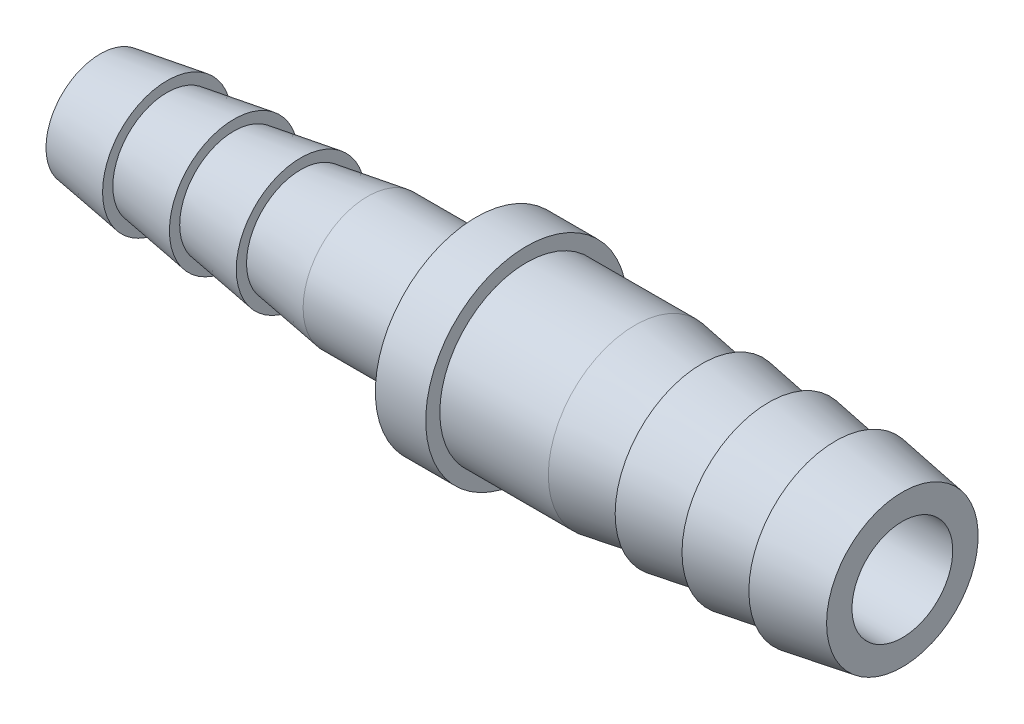
ISO-10303-21;
HEADER;
FILE_DESCRIPTION(('STEP AP214'),'2;1');
FILE_NAME('part.step','',(''),(''),'','','');
FILE_SCHEMA(('AUTOMOTIVE_DESIGN { 1 0 10303 214 1 1 1 1 }'));
ENDSEC;
DATA;
#1=APPLICATION_CONTEXT('core data for automotive mechanical design processes');
#2=APPLICATION_PROTOCOL_DEFINITION('international standard','automotive_design',2000,#1);
#3=PRODUCT_CONTEXT('',#1,'mechanical');
#4=PRODUCT('Part','Part','',(#3));
#5=PRODUCT_RELATED_PRODUCT_CATEGORY('part','',(#4));
#6=PRODUCT_DEFINITION_FORMATION('','',#4);
#7=PRODUCT_DEFINITION_CONTEXT('part definition',#1,'design');
#8=PRODUCT_DEFINITION('design','',#6,#7);
#9=PRODUCT_DEFINITION_SHAPE('','',#8);
#10=(LENGTH_UNIT() NAMED_UNIT(*) SI_UNIT(.MILLI.,.METRE.));
#11=(NAMED_UNIT(*) PLANE_ANGLE_UNIT() SI_UNIT($,.RADIAN.));
#12=(NAMED_UNIT(*) SI_UNIT($,.STERADIAN.) SOLID_ANGLE_UNIT());
#13=UNCERTAINTY_MEASURE_WITH_UNIT(LENGTH_MEASURE(1.E-05),#10,'distance_accuracy_value','');
#14=(GEOMETRIC_REPRESENTATION_CONTEXT(3) GLOBAL_UNCERTAINTY_ASSIGNED_CONTEXT((#13)) GLOBAL_UNIT_ASSIGNED_CONTEXT((#10,
#11,#12)) REPRESENTATION_CONTEXT('',''));
#15=CARTESIAN_POINT('',(0.,0.,0.));
#16=DIRECTION('',(0.,0.,1.));
#17=DIRECTION('',(1.,0.,0.));
#18=AXIS2_PLACEMENT_3D('',#15,#16,#17);
#19=CARTESIAN_POINT('',(1.5875,6.35,0.));
#20=DIRECTION('',(1.,0.,0.));
#21=DIRECTION('',(0.,0.,-1.));
#22=AXIS2_PLACEMENT_3D('',#19,#20,#21);
#23=PLANE('',#22);
#24=CARTESIAN_POINT('',(1.5875,0.,0.));
#25=DIRECTION('',(1.,0.,0.));
#26=DIRECTION('',(0.,0.,-1.));
#27=AXIS2_PLACEMENT_3D('',#24,#25,#26);
#28=CIRCLE('',#27,6.35);
#29=CARTESIAN_POINT('',(1.5875,0.,-6.35));
#30=VERTEX_POINT('',#29);
#31=EDGE_CURVE('E43',#30,#30,#28,.T.);
#32=ORIENTED_EDGE('',*,*,#31,.T.);
#33=EDGE_LOOP('',(#32));
#34=FACE_BOUND('',#33,.T.);
#35=CARTESIAN_POINT('',(1.5875,0.,0.));
#36=DIRECTION('',(1.,0.,0.));
#37=DIRECTION('',(0.,0.,-1.));
#38=AXIS2_PLACEMENT_3D('',#35,#36,#37);
#39=CIRCLE('',#38,5.461);
#40=CARTESIAN_POINT('',(1.5875,0.,-5.461));
#41=VERTEX_POINT('',#40);
#42=EDGE_CURVE('E34',#41,#41,#39,.F.);
#43=ORIENTED_EDGE('',*,*,#42,.T.);
#44=EDGE_LOOP('',(#43));
#45=FACE_BOUND('',#44,.T.);
#46=ADVANCED_FACE('F30',(#34,#45),#23,.T.);
#47=CARTESIAN_POINT('',(-25.273,0.,0.));
#48=DIRECTION('',(-1.,0.,0.));
#49=DIRECTION('',(0.,0.,1.));
#50=AXIS2_PLACEMENT_3D('',#47,#48,#49);
#51=CYLINDRICAL_SURFACE('',#50,4.064);
#52=CARTESIAN_POINT('',(-1.5875,0.,0.));
#53=DIRECTION('',(-1.,0.,0.));
#54=DIRECTION('',(0.,0.,1.));
#55=AXIS2_PLACEMENT_3D('',#52,#53,#54);
#56=CIRCLE('',#55,4.064);
#57=CARTESIAN_POINT('',(-1.5875,0.,4.064));
#58=VERTEX_POINT('',#57);
#59=EDGE_CURVE('E38',#58,#58,#56,.T.);
#60=ORIENTED_EDGE('',*,*,#59,.T.);
#61=EDGE_LOOP('',(#60));
#62=FACE_BOUND('',#61,.T.);
#63=CARTESIAN_POINT('',(-8.42433333333334,0.,0.));
#64=DIRECTION('',(-1.,0.,0.));
#65=DIRECTION('',(0.,0.,1.));
#66=AXIS2_PLACEMENT_3D('',#63,#64,#65);
#67=CIRCLE('',#66,4.064);
#68=CARTESIAN_POINT('',(-8.42433333333334,0.,4.064));
#69=VERTEX_POINT('',#68);
#70=EDGE_CURVE('E65',#69,#69,#67,.T.);
#71=ORIENTED_EDGE('',*,*,#70,.F.);
#72=EDGE_LOOP('',(#71));
#73=FACE_BOUND('',#72,.T.);
#74=ADVANCED_FACE('F128',(#62,#73),#51,.T.);
#75=CARTESIAN_POINT('',(-25.273,4.064,0.));
#76=DIRECTION('',(1.,0.,0.));
#77=DIRECTION('',(0.,0.,-1.));
#78=AXIS2_PLACEMENT_3D('',#75,#76,#77);
#79=PLANE('',#78);
#80=CARTESIAN_POINT('',(-25.273,0.,0.));
#81=DIRECTION('',(-1.,0.,0.));
#82=DIRECTION('',(0.,0.,1.));
#83=AXIS2_PLACEMENT_3D('',#80,#81,#82);
#84=CIRCLE('',#83,1.905);
#85=CARTESIAN_POINT('',(-25.273,0.,1.905));
#86=VERTEX_POINT('',#85);
#87=EDGE_CURVE('E10',#86,#86,#84,.T.);
#88=ORIENTED_EDGE('',*,*,#87,.F.);
#89=EDGE_LOOP('',(#88));
#90=FACE_BOUND('',#89,.T.);
#91=CARTESIAN_POINT('',(-25.273,0.,0.));
#92=DIRECTION('',(-1.,0.,0.));
#93=DIRECTION('',(0.,0.,1.));
#94=AXIS2_PLACEMENT_3D('',#91,#92,#93);
#95=CIRCLE('',#94,3.4163);
#96=CARTESIAN_POINT('',(-25.273,0.,3.4163));
#97=VERTEX_POINT('',#96);
#98=EDGE_CURVE('E50',#97,#97,#95,.T.);
#99=ORIENTED_EDGE('',*,*,#98,.T.);
#100=EDGE_LOOP('',(#99));
#101=FACE_BOUND('',#100,.T.);
#102=ADVANCED_FACE('F32',(#90,#101),#79,.F.);
#103=CARTESIAN_POINT('',(-25.273,0.,0.));
#104=DIRECTION('',(-1.,0.,0.));
#105=DIRECTION('',(0.,0.,1.));
#106=AXIS2_PLACEMENT_3D('',#103,#104,#105);
#107=CYLINDRICAL_SURFACE('',#106,1.905);
#108=CARTESIAN_POINT('',(2.032,0.,0.));
#109=DIRECTION('',(-1.,0.,0.));
#110=DIRECTION('',(0.,0.,1.));
#111=AXIS2_PLACEMENT_3D('',#108,#109,#110);
#112=CIRCLE('',#111,1.905);
#113=CARTESIAN_POINT('',(2.032,0.,1.905));
#114=VERTEX_POINT('',#113);
#115=EDGE_CURVE('E74',#114,#114,#112,.T.);
#116=ORIENTED_EDGE('',*,*,#115,.F.);
#117=EDGE_LOOP('',(#116));
#118=FACE_BOUND('',#117,.T.);
#119=ORIENTED_EDGE('',*,*,#87,.T.);
#120=EDGE_LOOP('',(#119));
#121=FACE_BOUND('',#120,.T.);
#122=ADVANCED_FACE('F143',(#118,#121),#107,.F.);
#123=CARTESIAN_POINT('',(-1.5875,6.35,0.));
#124=DIRECTION('',(-1.,0.,0.));
#125=DIRECTION('',(0.,0.,1.));
#126=AXIS2_PLACEMENT_3D('',#123,#124,#125);
#127=PLANE('',#126);
#128=CARTESIAN_POINT('',(-1.5875,0.,0.));
#129=DIRECTION('',(1.,0.,0.));
#130=DIRECTION('',(0.,0.,-1.));
#131=AXIS2_PLACEMENT_3D('',#128,#129,#130);
#132=CIRCLE('',#131,6.35);
#133=CARTESIAN_POINT('',(-1.5875,0.,-6.35));
#134=VERTEX_POINT('',#133);
#135=EDGE_CURVE('E47',#134,#134,#132,.T.);
#136=ORIENTED_EDGE('',*,*,#135,.F.);
#137=EDGE_LOOP('',(#136));
#138=FACE_BOUND('',#137,.T.);
#139=ORIENTED_EDGE('',*,*,#59,.F.);
#140=EDGE_LOOP('',(#139));
#141=FACE_BOUND('',#140,.T.);
#142=ADVANCED_FACE('F141',(#138,#141),#127,.T.);
#143=CARTESIAN_POINT('',(0.,0.,0.));
#144=DIRECTION('',(1.,0.,0.));
#145=DIRECTION('',(0.,0.,-1.));
#146=AXIS2_PLACEMENT_3D('',#143,#144,#145);
#147=CYLINDRICAL_SURFACE('',#146,6.35);
#148=ORIENTED_EDGE('',*,*,#135,.T.);
#149=EDGE_LOOP('',(#148));
#150=FACE_BOUND('',#149,.T.);
#151=ORIENTED_EDGE('',*,*,#31,.F.);
#152=EDGE_LOOP('',(#151));
#153=FACE_BOUND('',#152,.T.);
#154=ADVANCED_FACE('F139',(#150,#153),#147,.T.);
#155=CARTESIAN_POINT('',(-25.273,0.,0.));
#156=DIRECTION('',(1.,0.,0.));
#157=DIRECTION('',(0.,0.,-1.));
#158=AXIS2_PLACEMENT_3D('',#155,#156,#157);
#159=CONICAL_SURFACE('',#158,3.4163,0.152573805398656);
#160=CARTESIAN_POINT('',(-21.0608333333333,0.,0.));
#161=DIRECTION('',(-1.,0.,0.));
#162=DIRECTION('',(0.,0.,1.));
#163=AXIS2_PLACEMENT_3D('',#160,#161,#162);
#164=CIRCLE('',#163,4.064);
#165=CARTESIAN_POINT('',(-21.0608333333333,0.,4.064));
#166=VERTEX_POINT('',#165);
#167=EDGE_CURVE('E56',#166,#166,#164,.T.);
#168=ORIENTED_EDGE('',*,*,#167,.T.);
#169=EDGE_LOOP('',(#168));
#170=FACE_BOUND('',#169,.T.);
#171=ORIENTED_EDGE('',*,*,#98,.F.);
#172=EDGE_LOOP('',(#171));
#173=FACE_BOUND('',#172,.T.);
#174=ADVANCED_FACE('F189',(#170,#173),#159,.T.);
#175=CARTESIAN_POINT('',(-21.0608333333333,0.,0.));
#176=DIRECTION('',(1.,0.,0.));
#177=DIRECTION('',(0.,0.,-1.));
#178=AXIS2_PLACEMENT_3D('',#175,#176,#177);
#179=CONICAL_SURFACE('',#178,3.4163,0.152573805398656);
#180=CARTESIAN_POINT('',(-16.8486666666667,0.,0.));
#181=DIRECTION('',(-1.,0.,0.));
#182=DIRECTION('',(0.,0.,1.));
#183=AXIS2_PLACEMENT_3D('',#180,#181,#182);
#184=CIRCLE('',#183,4.064);
#185=CARTESIAN_POINT('',(-16.8486666666667,0.,4.064));
#186=VERTEX_POINT('',#185);
#187=EDGE_CURVE('E62',#186,#186,#184,.T.);
#188=ORIENTED_EDGE('',*,*,#187,.T.);
#189=EDGE_LOOP('',(#188));
#190=FACE_BOUND('',#189,.T.);
#191=CARTESIAN_POINT('',(-21.0608333333333,0.,0.));
#192=DIRECTION('',(-1.,0.,0.));
#193=DIRECTION('',(0.,0.,1.));
#194=AXIS2_PLACEMENT_3D('',#191,#192,#193);
#195=CIRCLE('',#194,3.4163);
#196=CARTESIAN_POINT('',(-21.0608333333333,0.,3.4163));
#197=VERTEX_POINT('',#196);
#198=EDGE_CURVE('E53',#197,#197,#195,.T.);
#199=ORIENTED_EDGE('',*,*,#198,.F.);
#200=EDGE_LOOP('',(#199));
#201=FACE_BOUND('',#200,.T.);
#202=ADVANCED_FACE('F186',(#190,#201),#179,.T.);
#203=CARTESIAN_POINT('',(-21.0608333333333,4.064,0.));
#204=DIRECTION('',(1.,0.,0.));
#205=DIRECTION('',(0.,0.,-1.));
#206=AXIS2_PLACEMENT_3D('',#203,#204,#205);
#207=PLANE('',#206);
#208=ORIENTED_EDGE('',*,*,#198,.T.);
#209=EDGE_LOOP('',(#208));
#210=FACE_BOUND('',#209,.T.);
#211=ORIENTED_EDGE('',*,*,#167,.F.);
#212=EDGE_LOOP('',(#211));
#213=FACE_BOUND('',#212,.T.);
#214=ADVANCED_FACE('F182',(#210,#213),#207,.T.);
#215=CARTESIAN_POINT('',(-16.8486666666667,0.,0.));
#216=DIRECTION('',(1.,0.,0.));
#217=DIRECTION('',(0.,0.,-1.));
#218=AXIS2_PLACEMENT_3D('',#215,#216,#217);
#219=CONICAL_SURFACE('',#218,3.4163,0.152573805398656);
#220=CARTESIAN_POINT('',(-12.6365,0.,0.));
#221=DIRECTION('',(-1.,0.,0.));
#222=DIRECTION('',(0.,0.,1.));
#223=AXIS2_PLACEMENT_3D('',#220,#221,#222);
#224=CIRCLE('',#223,4.064);
#225=CARTESIAN_POINT('',(-12.6365,0.,4.064));
#226=VERTEX_POINT('',#225);
#227=EDGE_CURVE('E71',#226,#226,#224,.T.);
#228=ORIENTED_EDGE('',*,*,#227,.T.);
#229=EDGE_LOOP('',(#228));
#230=FACE_BOUND('',#229,.T.);
#231=CARTESIAN_POINT('',(-16.8486666666667,0.,0.));
#232=DIRECTION('',(-1.,0.,0.));
#233=DIRECTION('',(0.,0.,1.));
#234=AXIS2_PLACEMENT_3D('',#231,#232,#233);
#235=CIRCLE('',#234,3.4163);
#236=CARTESIAN_POINT('',(-16.8486666666667,0.,3.4163));
#237=VERTEX_POINT('',#236);
#238=EDGE_CURVE('E59',#237,#237,#235,.T.);
#239=ORIENTED_EDGE('',*,*,#238,.F.);
#240=EDGE_LOOP('',(#239));
#241=FACE_BOUND('',#240,.T.);
#242=ADVANCED_FACE('F178',(#230,#241),#219,.T.);
#243=CARTESIAN_POINT('',(-16.8486666666667,4.064,0.));
#244=DIRECTION('',(1.,0.,0.));
#245=DIRECTION('',(0.,0.,-1.));
#246=AXIS2_PLACEMENT_3D('',#243,#244,#245);
#247=PLANE('',#246);
#248=ORIENTED_EDGE('',*,*,#238,.T.);
#249=EDGE_LOOP('',(#248));
#250=FACE_BOUND('',#249,.T.);
#251=ORIENTED_EDGE('',*,*,#187,.F.);
#252=EDGE_LOOP('',(#251));
#253=FACE_BOUND('',#252,.T.);
#254=ADVANCED_FACE('F174',(#250,#253),#247,.T.);
#255=CARTESIAN_POINT('',(-12.6365,0.,0.));
#256=DIRECTION('',(1.,0.,0.));
#257=DIRECTION('',(0.,0.,-1.));
#258=AXIS2_PLACEMENT_3D('',#255,#256,#257);
#259=CONICAL_SURFACE('',#258,3.4163,0.152573805398656);
#260=ORIENTED_EDGE('',*,*,#70,.T.);
#261=EDGE_LOOP('',(#260));
#262=FACE_BOUND('',#261,.T.);
#263=CARTESIAN_POINT('',(-12.6365,0.,0.));
#264=DIRECTION('',(-1.,0.,0.));
#265=DIRECTION('',(0.,0.,1.));
#266=AXIS2_PLACEMENT_3D('',#263,#264,#265);
#267=CIRCLE('',#266,3.4163);
#268=CARTESIAN_POINT('',(-12.6365,0.,3.4163));
#269=VERTEX_POINT('',#268);
#270=EDGE_CURVE('E68',#269,#269,#267,.T.);
#271=ORIENTED_EDGE('',*,*,#270,.F.);
#272=EDGE_LOOP('',(#271));
#273=FACE_BOUND('',#272,.T.);
#274=ADVANCED_FACE('F166',(#262,#273),#259,.T.);
#275=CARTESIAN_POINT('',(-12.6365,4.064,0.));
#276=DIRECTION('',(1.,0.,0.));
#277=DIRECTION('',(0.,0.,-1.));
#278=AXIS2_PLACEMENT_3D('',#275,#276,#277);
#279=PLANE('',#278);
#280=ORIENTED_EDGE('',*,*,#270,.T.);
#281=EDGE_LOOP('',(#280));
#282=FACE_BOUND('',#281,.T.);
#283=ORIENTED_EDGE('',*,*,#227,.F.);
#284=EDGE_LOOP('',(#283));
#285=FACE_BOUND('',#284,.T.);
#286=ADVANCED_FACE('F156',(#282,#285),#279,.T.);
#287=CARTESIAN_POINT('',(2.032,3.175,0.));
#288=DIRECTION('',(-1.,0.,0.));
#289=DIRECTION('',(0.,0.,1.));
#290=AXIS2_PLACEMENT_3D('',#287,#288,#289);
#291=PLANE('',#290);
#292=CARTESIAN_POINT('',(2.032,0.,0.));
#293=DIRECTION('',(-1.,0.,0.));
#294=DIRECTION('',(0.,0.,1.));
#295=AXIS2_PLACEMENT_3D('',#292,#293,#294);
#296=CIRCLE('',#295,3.175);
#297=CARTESIAN_POINT('',(2.032,0.,3.175));
#298=VERTEX_POINT('',#297);
#299=EDGE_CURVE('E77',#298,#298,#296,.T.);
#300=ORIENTED_EDGE('',*,*,#299,.F.);
#301=EDGE_LOOP('',(#300));
#302=FACE_BOUND('',#301,.T.);
#303=ORIENTED_EDGE('',*,*,#115,.T.);
#304=EDGE_LOOP('',(#303));
#305=FACE_BOUND('',#304,.T.);
#306=ADVANCED_FACE('F153',(#302,#305),#291,.F.);
#307=CARTESIAN_POINT('',(0.,0.,0.));
#308=DIRECTION('',(-1.,0.,0.));
#309=DIRECTION('',(0.,0.,1.));
#310=AXIS2_PLACEMENT_3D('',#307,#308,#309);
#311=CYLINDRICAL_SURFACE('',#310,3.175);
#312=CARTESIAN_POINT('',(25.273,0.,0.));
#313=DIRECTION('',(-1.,0.,0.));
#314=DIRECTION('',(0.,0.,1.));
#315=AXIS2_PLACEMENT_3D('',#312,#313,#314);
#316=CIRCLE('',#315,3.175);
#317=CARTESIAN_POINT('',(25.273,0.,3.175));
#318=VERTEX_POINT('',#317);
#319=EDGE_CURVE('E80',#318,#318,#316,.T.);
#320=ORIENTED_EDGE('',*,*,#319,.F.);
#321=EDGE_LOOP('',(#320));
#322=FACE_BOUND('',#321,.T.);
#323=ORIENTED_EDGE('',*,*,#299,.T.);
#324=EDGE_LOOP('',(#323));
#325=FACE_BOUND('',#324,.T.);
#326=ADVANCED_FACE('F155',(#322,#325),#311,.F.);
#327=CARTESIAN_POINT('',(0.,0.,0.));
#328=DIRECTION('',(-1.,0.,0.));
#329=DIRECTION('',(0.,0.,1.));
#330=AXIS2_PLACEMENT_3D('',#327,#328,#329);
#331=CYLINDRICAL_SURFACE('',#330,5.461);
#332=ORIENTED_EDGE('',*,*,#42,.F.);
#333=EDGE_LOOP('',(#332));
#334=FACE_BOUND('',#333,.T.);
#335=CARTESIAN_POINT('',(8.42433333333334,0.,0.));
#336=DIRECTION('',(-1.,0.,0.));
#337=DIRECTION('',(0.,0.,1.));
#338=AXIS2_PLACEMENT_3D('',#335,#336,#337);
#339=CIRCLE('',#338,5.461);
#340=CARTESIAN_POINT('',(8.42433333333334,0.,5.461));
#341=VERTEX_POINT('',#340);
#342=EDGE_CURVE('E98',#341,#341,#339,.T.);
#343=ORIENTED_EDGE('',*,*,#342,.T.);
#344=EDGE_LOOP('',(#343));
#345=FACE_BOUND('',#344,.T.);
#346=ADVANCED_FACE('F163',(#334,#345),#331,.T.);
#347=CARTESIAN_POINT('',(25.273,5.461,0.));
#348=DIRECTION('',(-1.,0.,0.));
#349=DIRECTION('',(0.,0.,1.));
#350=AXIS2_PLACEMENT_3D('',#347,#348,#349);
#351=PLANE('',#350);
#352=ORIENTED_EDGE('',*,*,#319,.T.);
#353=EDGE_LOOP('',(#352));
#354=FACE_BOUND('',#353,.T.);
#355=CARTESIAN_POINT('',(25.273,0.,0.));
#356=DIRECTION('',(-1.,0.,0.));
#357=DIRECTION('',(0.,0.,1.));
#358=AXIS2_PLACEMENT_3D('',#355,#356,#357);
#359=CIRCLE('',#358,4.7752);
#360=CARTESIAN_POINT('',(25.273,0.,4.7752));
#361=VERTEX_POINT('',#360);
#362=EDGE_CURVE('E83',#361,#361,#359,.T.);
#363=ORIENTED_EDGE('',*,*,#362,.F.);
#364=EDGE_LOOP('',(#363));
#365=FACE_BOUND('',#364,.T.);
#366=ADVANCED_FACE('F295',(#354,#365),#351,.F.);
#367=CARTESIAN_POINT('',(21.0608333333333,0.,0.));
#368=DIRECTION('',(-1.,0.,0.));
#369=DIRECTION('',(0.,0.,1.));
#370=AXIS2_PLACEMENT_3D('',#367,#368,#369);
#371=CONICAL_SURFACE('',#370,5.461,0.161397879609421);
#372=ORIENTED_EDGE('',*,*,#362,.T.);
#373=EDGE_LOOP('',(#372));
#374=FACE_BOUND('',#373,.T.);
#375=CARTESIAN_POINT('',(21.0608333333333,0.,0.));
#376=DIRECTION('',(-1.,0.,0.));
#377=DIRECTION('',(0.,0.,1.));
#378=AXIS2_PLACEMENT_3D('',#375,#376,#377);
#379=CIRCLE('',#378,5.461);
#380=CARTESIAN_POINT('',(21.0608333333333,0.,5.461));
#381=VERTEX_POINT('',#380);
#382=EDGE_CURVE('E89',#381,#381,#379,.T.);
#383=ORIENTED_EDGE('',*,*,#382,.F.);
#384=EDGE_LOOP('',(#383));
#385=FACE_BOUND('',#384,.T.);
#386=ADVANCED_FACE('F304',(#374,#385),#371,.T.);
#387=CARTESIAN_POINT('',(16.8486666666667,0.,0.));
#388=DIRECTION('',(-1.,0.,0.));
#389=DIRECTION('',(0.,0.,1.));
#390=AXIS2_PLACEMENT_3D('',#387,#388,#389);
#391=CONICAL_SURFACE('',#390,5.461,0.161397879609421);
#392=CARTESIAN_POINT('',(21.0608333333333,0.,0.));
#393=DIRECTION('',(-1.,0.,0.));
#394=DIRECTION('',(0.,0.,1.));
#395=AXIS2_PLACEMENT_3D('',#392,#393,#394);
#396=CIRCLE('',#395,4.7752);
#397=CARTESIAN_POINT('',(21.0608333333333,0.,4.7752));
#398=VERTEX_POINT('',#397);
#399=EDGE_CURVE('E86',#398,#398,#396,.T.);
#400=ORIENTED_EDGE('',*,*,#399,.T.);
#401=EDGE_LOOP('',(#400));
#402=FACE_BOUND('',#401,.T.);
#403=CARTESIAN_POINT('',(16.8486666666667,0.,0.));
#404=DIRECTION('',(-1.,0.,0.));
#405=DIRECTION('',(0.,0.,1.));
#406=AXIS2_PLACEMENT_3D('',#403,#404,#405);
#407=CIRCLE('',#406,5.461);
#408=CARTESIAN_POINT('',(16.8486666666667,0.,5.461));
#409=VERTEX_POINT('',#408);
#410=EDGE_CURVE('E95',#409,#409,#407,.T.);
#411=ORIENTED_EDGE('',*,*,#410,.F.);
#412=EDGE_LOOP('',(#411));
#413=FACE_BOUND('',#412,.T.);
#414=ADVANCED_FACE('F124',(#402,#413),#391,.T.);
#415=CARTESIAN_POINT('',(21.0608333333333,5.461,0.));
#416=DIRECTION('',(-1.,0.,0.));
#417=DIRECTION('',(0.,0.,1.));
#418=AXIS2_PLACEMENT_3D('',#415,#416,#417);
#419=PLANE('',#418);
#420=ORIENTED_EDGE('',*,*,#382,.T.);
#421=EDGE_LOOP('',(#420));
#422=FACE_BOUND('',#421,.T.);
#423=ORIENTED_EDGE('',*,*,#399,.F.);
#424=EDGE_LOOP('',(#423));
#425=FACE_BOUND('',#424,.T.);
#426=ADVANCED_FACE('F114',(#422,#425),#419,.T.);
#427=CARTESIAN_POINT('',(12.6365,0.,0.));
#428=DIRECTION('',(-1.,0.,0.));
#429=DIRECTION('',(0.,0.,1.));
#430=AXIS2_PLACEMENT_3D('',#427,#428,#429);
#431=CONICAL_SURFACE('',#430,5.461,0.161397879609421);
#432=CARTESIAN_POINT('',(16.8486666666667,0.,0.));
#433=DIRECTION('',(-1.,0.,0.));
#434=DIRECTION('',(0.,0.,1.));
#435=AXIS2_PLACEMENT_3D('',#432,#433,#434);
#436=CIRCLE('',#435,4.7752);
#437=CARTESIAN_POINT('',(16.8486666666667,0.,4.7752));
#438=VERTEX_POINT('',#437);
#439=EDGE_CURVE('E92',#438,#438,#436,.T.);
#440=ORIENTED_EDGE('',*,*,#439,.T.);
#441=EDGE_LOOP('',(#440));
#442=FACE_BOUND('',#441,.T.);
#443=CARTESIAN_POINT('',(12.6365,0.,0.));
#444=DIRECTION('',(-1.,0.,0.));
#445=DIRECTION('',(0.,0.,1.));
#446=AXIS2_PLACEMENT_3D('',#443,#444,#445);
#447=CIRCLE('',#446,5.461);
#448=CARTESIAN_POINT('',(12.6365,0.,5.461));
#449=VERTEX_POINT('',#448);
#450=EDGE_CURVE('E104',#449,#449,#447,.T.);
#451=ORIENTED_EDGE('',*,*,#450,.F.);
#452=EDGE_LOOP('',(#451));
#453=FACE_BOUND('',#452,.T.);
#454=ADVANCED_FACE('F111',(#442,#453),#431,.T.);
#455=CARTESIAN_POINT('',(16.8486666666667,5.461,0.));
#456=DIRECTION('',(-1.,0.,0.));
#457=DIRECTION('',(0.,0.,1.));
#458=AXIS2_PLACEMENT_3D('',#455,#456,#457);
#459=PLANE('',#458);
#460=ORIENTED_EDGE('',*,*,#410,.T.);
#461=EDGE_LOOP('',(#460));
#462=FACE_BOUND('',#461,.T.);
#463=ORIENTED_EDGE('',*,*,#439,.F.);
#464=EDGE_LOOP('',(#463));
#465=FACE_BOUND('',#464,.T.);
#466=ADVANCED_FACE('F113',(#462,#465),#459,.T.);
#467=CARTESIAN_POINT('',(8.42433333333334,0.,0.));
#468=DIRECTION('',(-1.,0.,0.));
#469=DIRECTION('',(0.,0.,1.));
#470=AXIS2_PLACEMENT_3D('',#467,#468,#469);
#471=CONICAL_SURFACE('',#470,5.461,0.161397879609421);
#472=CARTESIAN_POINT('',(12.6365,0.,0.));
#473=DIRECTION('',(-1.,0.,0.));
#474=DIRECTION('',(0.,0.,1.));
#475=AXIS2_PLACEMENT_3D('',#472,#473,#474);
#476=CIRCLE('',#475,4.7752);
#477=CARTESIAN_POINT('',(12.6365,0.,4.7752));
#478=VERTEX_POINT('',#477);
#479=EDGE_CURVE('E101',#478,#478,#476,.T.);
#480=ORIENTED_EDGE('',*,*,#479,.T.);
#481=EDGE_LOOP('',(#480));
#482=FACE_BOUND('',#481,.T.);
#483=ORIENTED_EDGE('',*,*,#342,.F.);
#484=EDGE_LOOP('',(#483));
#485=FACE_BOUND('',#484,.T.);
#486=ADVANCED_FACE('F121',(#482,#485),#471,.T.);
#487=CARTESIAN_POINT('',(12.6365,5.461,0.));
#488=DIRECTION('',(-1.,0.,0.));
#489=DIRECTION('',(0.,0.,1.));
#490=AXIS2_PLACEMENT_3D('',#487,#488,#489);
#491=PLANE('',#490);
#492=ORIENTED_EDGE('',*,*,#450,.T.);
#493=EDGE_LOOP('',(#492));
#494=FACE_BOUND('',#493,.T.);
#495=ORIENTED_EDGE('',*,*,#479,.F.);
#496=EDGE_LOOP('',(#495));
#497=FACE_BOUND('',#496,.T.);
#498=ADVANCED_FACE('F108',(#494,#497),#491,.T.);
#499=CLOSED_SHELL('',(#46,#74,#102,#122,#142,#154,#174,#202,#214,#242,#254,#274,#286,#306,#326,
#346,#366,#386,#414,#426,#454,#466,#486,#498));
#500=MANIFOLD_SOLID_BREP('B2',#499);
#501=ADVANCED_BREP_SHAPE_REPRESENTATION('',(#18,#500),#14);
#502=SHAPE_DEFINITION_REPRESENTATION(#9,#501);
ENDSEC;
END-ISO-10303-21;
